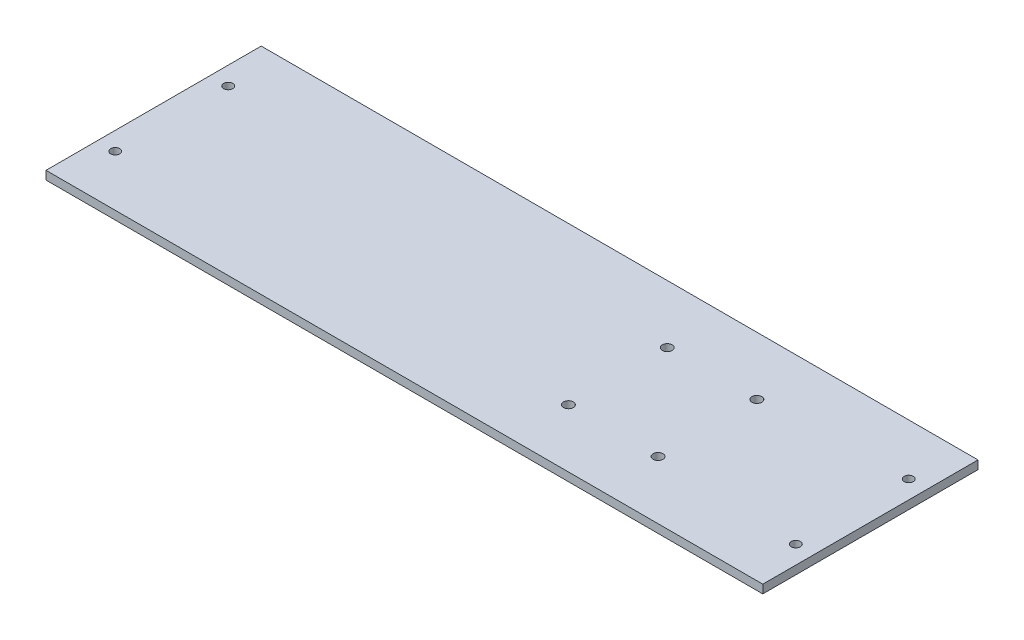
ISO-10303-21;
HEADER;
FILE_DESCRIPTION(('STEP AP214'),'2;1');
FILE_NAME('part.step','',(''),(''),'','','');
FILE_SCHEMA(('AUTOMOTIVE_DESIGN { 1 0 10303 214 1 1 1 1 }'));
ENDSEC;
DATA;
#1=APPLICATION_CONTEXT('core data for automotive mechanical design processes');
#2=APPLICATION_PROTOCOL_DEFINITION('international standard','automotive_design',2000,#1);
#3=PRODUCT_CONTEXT('',#1,'mechanical');
#4=PRODUCT('Part','Part','',(#3));
#5=PRODUCT_RELATED_PRODUCT_CATEGORY('part','',(#4));
#6=PRODUCT_DEFINITION_FORMATION('','',#4);
#7=PRODUCT_DEFINITION_CONTEXT('part definition',#1,'design');
#8=PRODUCT_DEFINITION('design','',#6,#7);
#9=PRODUCT_DEFINITION_SHAPE('','',#8);
#10=(LENGTH_UNIT() NAMED_UNIT(*) SI_UNIT(.MILLI.,.METRE.));
#11=(NAMED_UNIT(*) PLANE_ANGLE_UNIT() SI_UNIT($,.RADIAN.));
#12=(NAMED_UNIT(*) SI_UNIT($,.STERADIAN.) SOLID_ANGLE_UNIT());
#13=UNCERTAINTY_MEASURE_WITH_UNIT(LENGTH_MEASURE(1.E-05),#10,'distance_accuracy_value','');
#14=(GEOMETRIC_REPRESENTATION_CONTEXT(3) GLOBAL_UNCERTAINTY_ASSIGNED_CONTEXT((#13)) GLOBAL_UNIT_ASSIGNED_CONTEXT((#10,
#11,#12)) REPRESENTATION_CONTEXT('',''));
#15=CARTESIAN_POINT('',(0.,0.,0.));
#16=DIRECTION('',(0.,0.,1.));
#17=DIRECTION('',(1.,0.,0.));
#18=AXIS2_PLACEMENT_3D('',#15,#16,#17);
#19=CARTESIAN_POINT('',(253.8,6.,-76.2));
#20=DIRECTION('',(-1.,0.,0.));
#21=DIRECTION('',(0.,0.,1.));
#22=AXIS2_PLACEMENT_3D('',#19,#20,#21);
#23=PLANE('',#22);
#24=DIRECTION('',(0.,0.,-1.));
#25=VECTOR('',#24,1.);
#26=CARTESIAN_POINT('',(253.8,0.,-76.2));
#27=LINE('',#26,#25);
#28=CARTESIAN_POINT('',(253.8,0.,76.2));
#29=VERTEX_POINT('',#28);
#30=CARTESIAN_POINT('',(253.8,0.,-76.2));
#31=VERTEX_POINT('',#30);
#32=EDGE_CURVE('E112',#29,#31,#27,.T.);
#33=ORIENTED_EDGE('',*,*,#32,.T.);
#34=DIRECTION('',(0.,-1.,0.));
#35=VECTOR('',#34,1.);
#36=CARTESIAN_POINT('',(253.8,6.,-76.2));
#37=LINE('',#36,#35);
#38=CARTESIAN_POINT('',(253.8,6.,-76.2));
#39=VERTEX_POINT('',#38);
#40=EDGE_CURVE('E11',#39,#31,#37,.T.);
#41=ORIENTED_EDGE('',*,*,#40,.F.);
#42=DIRECTION('',(0.,0.,-1.));
#43=VECTOR('',#42,1.);
#44=CARTESIAN_POINT('',(253.8,6.,-76.2));
#45=LINE('',#44,#43);
#46=CARTESIAN_POINT('',(253.8,6.,76.2));
#47=VERTEX_POINT('',#46);
#48=EDGE_CURVE('E96',#47,#39,#45,.T.);
#49=ORIENTED_EDGE('',*,*,#48,.F.);
#50=DIRECTION('',(0.,-1.,0.));
#51=VECTOR('',#50,1.);
#52=CARTESIAN_POINT('',(253.8,6.,76.2));
#53=LINE('',#52,#51);
#54=EDGE_CURVE('E108',#47,#29,#53,.T.);
#55=ORIENTED_EDGE('',*,*,#54,.T.);
#56=EDGE_LOOP('',(#33,#41,#49,#55));
#57=FACE_BOUND('',#56,.T.);
#58=ADVANCED_FACE('F44',(#57),#23,.F.);
#59=CARTESIAN_POINT('',(-253.8,6.,-76.2));
#60=DIRECTION('',(0.,0.,1.));
#61=DIRECTION('',(1.,0.,0.));
#62=AXIS2_PLACEMENT_3D('',#59,#60,#61);
#63=PLANE('',#62);
#64=DIRECTION('',(-1.,0.,0.));
#65=VECTOR('',#64,1.);
#66=CARTESIAN_POINT('',(-253.8,0.,-76.2));
#67=LINE('',#66,#65);
#68=CARTESIAN_POINT('',(-253.8,0.,-76.2));
#69=VERTEX_POINT('',#68);
#70=EDGE_CURVE('E101',#31,#69,#67,.T.);
#71=ORIENTED_EDGE('',*,*,#70,.T.);
#72=DIRECTION('',(0.,-1.,0.));
#73=VECTOR('',#72,1.);
#74=CARTESIAN_POINT('',(-253.8,6.,-76.2));
#75=LINE('',#74,#73);
#76=CARTESIAN_POINT('',(-253.8,6.,-76.2));
#77=VERTEX_POINT('',#76);
#78=EDGE_CURVE('E53',#77,#69,#75,.T.);
#79=ORIENTED_EDGE('',*,*,#78,.F.);
#80=DIRECTION('',(-1.,0.,0.));
#81=VECTOR('',#80,1.);
#82=CARTESIAN_POINT('',(-253.8,6.,-76.2));
#83=LINE('',#82,#81);
#84=EDGE_CURVE('E91',#39,#77,#83,.T.);
#85=ORIENTED_EDGE('',*,*,#84,.F.);
#86=ORIENTED_EDGE('',*,*,#40,.T.);
#87=EDGE_LOOP('',(#71,#79,#85,#86));
#88=FACE_BOUND('',#87,.T.);
#89=ADVANCED_FACE('F100',(#88),#63,.F.);
#90=CARTESIAN_POINT('',(-253.8,6.,-76.2));
#91=DIRECTION('',(1.,0.,0.));
#92=DIRECTION('',(0.,0.,-1.));
#93=AXIS2_PLACEMENT_3D('',#90,#91,#92);
#94=PLANE('',#93);
#95=DIRECTION('',(0.,0.,1.));
#96=VECTOR('',#95,1.);
#97=CARTESIAN_POINT('',(-253.8,0.,-76.2));
#98=LINE('',#97,#96);
#99=CARTESIAN_POINT('',(-253.8,0.,76.2));
#100=VERTEX_POINT('',#99);
#101=EDGE_CURVE('E78',#69,#100,#98,.T.);
#102=ORIENTED_EDGE('',*,*,#101,.T.);
#103=DIRECTION('',(0.,-1.,0.));
#104=VECTOR('',#103,1.);
#105=CARTESIAN_POINT('',(-253.8,6.,76.2));
#106=LINE('',#105,#104);
#107=CARTESIAN_POINT('',(-253.8,6.,76.2));
#108=VERTEX_POINT('',#107);
#109=EDGE_CURVE('E103',#108,#100,#106,.T.);
#110=ORIENTED_EDGE('',*,*,#109,.F.);
#111=DIRECTION('',(0.,0.,1.));
#112=VECTOR('',#111,1.);
#113=CARTESIAN_POINT('',(-253.8,6.,-76.2));
#114=LINE('',#113,#112);
#115=EDGE_CURVE('E94',#77,#108,#114,.T.);
#116=ORIENTED_EDGE('',*,*,#115,.F.);
#117=ORIENTED_EDGE('',*,*,#78,.T.);
#118=EDGE_LOOP('',(#102,#110,#116,#117));
#119=FACE_BOUND('',#118,.T.);
#120=ADVANCED_FACE('F104',(#119),#94,.F.);
#121=CARTESIAN_POINT('',(-253.8,6.,76.2));
#122=DIRECTION('',(0.,0.,-1.));
#123=DIRECTION('',(-1.,0.,0.));
#124=AXIS2_PLACEMENT_3D('',#121,#122,#123);
#125=PLANE('',#124);
#126=DIRECTION('',(1.,0.,0.));
#127=VECTOR('',#126,1.);
#128=CARTESIAN_POINT('',(-253.8,0.,76.2));
#129=LINE('',#128,#127);
#130=EDGE_CURVE('E84',#100,#29,#129,.T.);
#131=ORIENTED_EDGE('',*,*,#130,.T.);
#132=ORIENTED_EDGE('',*,*,#54,.F.);
#133=DIRECTION('',(1.,0.,0.));
#134=VECTOR('',#133,1.);
#135=CARTESIAN_POINT('',(-253.8,6.,76.2));
#136=LINE('',#135,#134);
#137=EDGE_CURVE('E61',#108,#47,#136,.T.);
#138=ORIENTED_EDGE('',*,*,#137,.F.);
#139=ORIENTED_EDGE('',*,*,#109,.T.);
#140=EDGE_LOOP('',(#131,#132,#138,#139));
#141=FACE_BOUND('',#140,.T.);
#142=ADVANCED_FACE('F126',(#141),#125,.F.);
#143=CARTESIAN_POINT('',(0.,6.,0.));
#144=DIRECTION('',(0.,1.,0.));
#145=DIRECTION('',(0.,0.,1.));
#146=AXIS2_PLACEMENT_3D('',#143,#144,#145);
#147=PLANE('',#146);
#148=CARTESIAN_POINT('',(138.430000000001,6.,34.9999999999998));
#149=DIRECTION('',(0.,1.,0.));
#150=DIRECTION('',(0.,0.,1.));
#151=AXIS2_PLACEMENT_3D('',#148,#149,#150);
#152=CIRCLE('',#151,3.49999999999999);
#153=CARTESIAN_POINT('',(138.430000000001,6.,38.4999999999998));
#154=VERTEX_POINT('',#153);
#155=EDGE_CURVE('E177',#154,#154,#152,.T.);
#156=ORIENTED_EDGE('',*,*,#155,.F.);
#157=EDGE_LOOP('',(#156));
#158=FACE_BOUND('',#157,.T.);
#159=CARTESIAN_POINT('',(74.9300000000006,6.,35.0000000000002));
#160=DIRECTION('',(0.,1.,0.));
#161=DIRECTION('',(0.,0.,1.));
#162=AXIS2_PLACEMENT_3D('',#159,#160,#161);
#163=CIRCLE('',#162,3.49999999999999);
#164=CARTESIAN_POINT('',(74.9300000000006,6.,38.5000000000002));
#165=VERTEX_POINT('',#164);
#166=EDGE_CURVE('E185',#165,#165,#163,.T.);
#167=ORIENTED_EDGE('',*,*,#166,.F.);
#168=EDGE_LOOP('',(#167));
#169=FACE_BOUND('',#168,.T.);
#170=CARTESIAN_POINT('',(74.9299999999999,6.,-34.9999999999998));
#171=DIRECTION('',(0.,1.,0.));
#172=DIRECTION('',(0.,0.,1.));
#173=AXIS2_PLACEMENT_3D('',#170,#171,#172);
#174=CIRCLE('',#173,3.49999999999999);
#175=CARTESIAN_POINT('',(74.9299999999999,6.,-31.4999999999998));
#176=VERTEX_POINT('',#175);
#177=EDGE_CURVE('E169',#176,#176,#174,.T.);
#178=ORIENTED_EDGE('',*,*,#177,.F.);
#179=EDGE_LOOP('',(#178));
#180=FACE_BOUND('',#179,.T.);
#181=CARTESIAN_POINT('',(138.43,6.,-35.0000000000002));
#182=DIRECTION('',(0.,1.,0.));
#183=DIRECTION('',(0.,0.,1.));
#184=AXIS2_PLACEMENT_3D('',#181,#182,#183);
#185=CIRCLE('',#184,3.49999999999999);
#186=CARTESIAN_POINT('',(138.43,6.,-31.5000000000002));
#187=VERTEX_POINT('',#186);
#188=EDGE_CURVE('E165',#187,#187,#185,.T.);
#189=ORIENTED_EDGE('',*,*,#188,.F.);
#190=EDGE_LOOP('',(#189));
#191=FACE_BOUND('',#190,.T.);
#192=CARTESIAN_POINT('',(240.96,6.,40.));
#193=DIRECTION('',(0.,1.,0.));
#194=DIRECTION('',(0.,0.,1.));
#195=AXIS2_PLACEMENT_3D('',#192,#193,#194);
#196=CIRCLE('',#195,3.25000000000001);
#197=CARTESIAN_POINT('',(240.96,6.,43.25));
#198=VERTEX_POINT('',#197);
#199=EDGE_CURVE('E137',#198,#198,#196,.T.);
#200=ORIENTED_EDGE('',*,*,#199,.F.);
#201=EDGE_LOOP('',(#200));
#202=FACE_BOUND('',#201,.T.);
#203=CARTESIAN_POINT('',(-240.96,6.,-39.9999999999966));
#204=DIRECTION('',(0.,1.,0.));
#205=DIRECTION('',(0.,0.,1.));
#206=AXIS2_PLACEMENT_3D('',#203,#204,#205);
#207=CIRCLE('',#206,3.25000000000001);
#208=CARTESIAN_POINT('',(-240.96,6.,-36.7499999999966));
#209=VERTEX_POINT('',#208);
#210=EDGE_CURVE('E145',#209,#209,#207,.T.);
#211=ORIENTED_EDGE('',*,*,#210,.F.);
#212=EDGE_LOOP('',(#211));
#213=FACE_BOUND('',#212,.T.);
#214=CARTESIAN_POINT('',(-240.96,6.,40.0000000000034));
#215=DIRECTION('',(0.,1.,0.));
#216=DIRECTION('',(0.,0.,1.));
#217=AXIS2_PLACEMENT_3D('',#214,#215,#216);
#218=CIRCLE('',#217,3.25000000000001);
#219=CARTESIAN_POINT('',(-240.96,6.,43.2500000000034));
#220=VERTEX_POINT('',#219);
#221=EDGE_CURVE('E146',#220,#220,#218,.T.);
#222=ORIENTED_EDGE('',*,*,#221,.F.);
#223=EDGE_LOOP('',(#222));
#224=FACE_BOUND('',#223,.T.);
#225=CARTESIAN_POINT('',(240.96,6.,-40.));
#226=DIRECTION('',(0.,1.,0.));
#227=DIRECTION('',(0.,0.,1.));
#228=AXIS2_PLACEMENT_3D('',#225,#226,#227);
#229=CIRCLE('',#228,3.25000000000001);
#230=CARTESIAN_POINT('',(240.96,6.,-36.75));
#231=VERTEX_POINT('',#230);
#232=EDGE_CURVE('E133',#231,#231,#229,.T.);
#233=ORIENTED_EDGE('',*,*,#232,.F.);
#234=EDGE_LOOP('',(#233));
#235=FACE_BOUND('',#234,.T.);
#236=ORIENTED_EDGE('',*,*,#48,.T.);
#237=ORIENTED_EDGE('',*,*,#84,.T.);
#238=ORIENTED_EDGE('',*,*,#115,.T.);
#239=ORIENTED_EDGE('',*,*,#137,.T.);
#240=EDGE_LOOP('',(#236,#237,#238,#239));
#241=FACE_BOUND('',#240,.T.);
#242=ADVANCED_FACE('F92',(#158,#169,#180,#191,#202,#213,#224,#235,#241),#147,.T.);
#243=CARTESIAN_POINT('',(0.,0.,0.));
#244=DIRECTION('',(0.,1.,0.));
#245=DIRECTION('',(0.,0.,1.));
#246=AXIS2_PLACEMENT_3D('',#243,#244,#245);
#247=PLANE('',#246);
#248=CARTESIAN_POINT('',(138.430000000001,0.,34.9999999999998));
#249=DIRECTION('',(0.,1.,0.));
#250=DIRECTION('',(0.,0.,1.));
#251=AXIS2_PLACEMENT_3D('',#248,#249,#250);
#252=CIRCLE('',#251,3.49999999999999);
#253=CARTESIAN_POINT('',(138.430000000001,0.,38.4999999999998));
#254=VERTEX_POINT('',#253);
#255=EDGE_CURVE('E173',#254,#254,#252,.T.);
#256=ORIENTED_EDGE('',*,*,#255,.T.);
#257=EDGE_LOOP('',(#256));
#258=FACE_BOUND('',#257,.T.);
#259=CARTESIAN_POINT('',(74.9300000000006,0.,35.0000000000002));
#260=DIRECTION('',(0.,1.,0.));
#261=DIRECTION('',(0.,0.,1.));
#262=AXIS2_PLACEMENT_3D('',#259,#260,#261);
#263=CIRCLE('',#262,3.49999999999999);
#264=CARTESIAN_POINT('',(74.9300000000006,0.,38.5000000000002));
#265=VERTEX_POINT('',#264);
#266=EDGE_CURVE('E181',#265,#265,#263,.T.);
#267=ORIENTED_EDGE('',*,*,#266,.T.);
#268=EDGE_LOOP('',(#267));
#269=FACE_BOUND('',#268,.T.);
#270=CARTESIAN_POINT('',(74.9299999999999,0.,-34.9999999999998));
#271=DIRECTION('',(0.,1.,0.));
#272=DIRECTION('',(0.,0.,1.));
#273=AXIS2_PLACEMENT_3D('',#270,#271,#272);
#274=CIRCLE('',#273,3.49999999999999);
#275=CARTESIAN_POINT('',(74.9299999999999,0.,-31.4999999999998));
#276=VERTEX_POINT('',#275);
#277=EDGE_CURVE('E189',#276,#276,#274,.T.);
#278=ORIENTED_EDGE('',*,*,#277,.T.);
#279=EDGE_LOOP('',(#278));
#280=FACE_BOUND('',#279,.T.);
#281=CARTESIAN_POINT('',(138.43,0.,-35.0000000000002));
#282=DIRECTION('',(0.,1.,0.));
#283=DIRECTION('',(0.,0.,1.));
#284=AXIS2_PLACEMENT_3D('',#281,#282,#283);
#285=CIRCLE('',#284,3.49999999999999);
#286=CARTESIAN_POINT('',(138.43,0.,-31.5000000000002));
#287=VERTEX_POINT('',#286);
#288=EDGE_CURVE('E161',#287,#287,#285,.T.);
#289=ORIENTED_EDGE('',*,*,#288,.T.);
#290=EDGE_LOOP('',(#289));
#291=FACE_BOUND('',#290,.T.);
#292=CARTESIAN_POINT('',(240.96,0.,40.));
#293=DIRECTION('',(0.,1.,0.));
#294=DIRECTION('',(0.,0.,1.));
#295=AXIS2_PLACEMENT_3D('',#292,#293,#294);
#296=CIRCLE('',#295,3.25000000000001);
#297=CARTESIAN_POINT('',(240.96,0.,43.25));
#298=VERTEX_POINT('',#297);
#299=EDGE_CURVE('E150',#298,#298,#296,.T.);
#300=ORIENTED_EDGE('',*,*,#299,.T.);
#301=EDGE_LOOP('',(#300));
#302=FACE_BOUND('',#301,.T.);
#303=CARTESIAN_POINT('',(-240.96,0.,-39.9999999999966));
#304=DIRECTION('',(0.,1.,0.));
#305=DIRECTION('',(0.,0.,1.));
#306=AXIS2_PLACEMENT_3D('',#303,#304,#305);
#307=CIRCLE('',#306,3.25000000000001);
#308=CARTESIAN_POINT('',(-240.96,0.,-36.7499999999966));
#309=VERTEX_POINT('',#308);
#310=EDGE_CURVE('E141',#309,#309,#307,.T.);
#311=ORIENTED_EDGE('',*,*,#310,.T.);
#312=EDGE_LOOP('',(#311));
#313=FACE_BOUND('',#312,.T.);
#314=CARTESIAN_POINT('',(-240.96,0.,40.0000000000034));
#315=DIRECTION('',(0.,1.,0.));
#316=DIRECTION('',(0.,0.,1.));
#317=AXIS2_PLACEMENT_3D('',#314,#315,#316);
#318=CIRCLE('',#317,3.25000000000001);
#319=CARTESIAN_POINT('',(-240.96,0.,43.2500000000034));
#320=VERTEX_POINT('',#319);
#321=EDGE_CURVE('E157',#320,#320,#318,.T.);
#322=ORIENTED_EDGE('',*,*,#321,.T.);
#323=EDGE_LOOP('',(#322));
#324=FACE_BOUND('',#323,.T.);
#325=CARTESIAN_POINT('',(240.96,0.,-40.));
#326=DIRECTION('',(0.,1.,0.));
#327=DIRECTION('',(0.,0.,1.));
#328=AXIS2_PLACEMENT_3D('',#325,#326,#327);
#329=CIRCLE('',#328,3.25000000000001);
#330=CARTESIAN_POINT('',(240.96,0.,-36.75));
#331=VERTEX_POINT('',#330);
#332=EDGE_CURVE('E116',#331,#331,#329,.T.);
#333=ORIENTED_EDGE('',*,*,#332,.T.);
#334=EDGE_LOOP('',(#333));
#335=FACE_BOUND('',#334,.T.);
#336=ORIENTED_EDGE('',*,*,#32,.F.);
#337=ORIENTED_EDGE('',*,*,#130,.F.);
#338=ORIENTED_EDGE('',*,*,#101,.F.);
#339=ORIENTED_EDGE('',*,*,#70,.F.);
#340=EDGE_LOOP('',(#336,#337,#338,#339));
#341=FACE_BOUND('',#340,.T.);
#342=ADVANCED_FACE('F129',(#258,#269,#280,#291,#302,#313,#324,#335,#341),#247,.F.);
#343=CARTESIAN_POINT('',(240.96,0.,-40.));
#344=DIRECTION('',(0.,1.,0.));
#345=DIRECTION('',(0.,0.,1.));
#346=AXIS2_PLACEMENT_3D('',#343,#344,#345);
#347=CYLINDRICAL_SURFACE('',#346,3.25000000000001);
#348=ORIENTED_EDGE('',*,*,#332,.F.);
#349=EDGE_LOOP('',(#348));
#350=FACE_BOUND('',#349,.T.);
#351=ORIENTED_EDGE('',*,*,#232,.T.);
#352=EDGE_LOOP('',(#351));
#353=FACE_BOUND('',#352,.T.);
#354=ADVANCED_FACE('F213',(#350,#353),#347,.F.);
#355=CARTESIAN_POINT('',(-240.96,0.,40.0000000000034));
#356=DIRECTION('',(0.,1.,0.));
#357=DIRECTION('',(0.,0.,1.));
#358=AXIS2_PLACEMENT_3D('',#355,#356,#357);
#359=CYLINDRICAL_SURFACE('',#358,3.25000000000001);
#360=ORIENTED_EDGE('',*,*,#321,.F.);
#361=EDGE_LOOP('',(#360));
#362=FACE_BOUND('',#361,.T.);
#363=ORIENTED_EDGE('',*,*,#221,.T.);
#364=EDGE_LOOP('',(#363));
#365=FACE_BOUND('',#364,.T.);
#366=ADVANCED_FACE('F215',(#362,#365),#359,.F.);
#367=CARTESIAN_POINT('',(-240.96,0.,-39.9999999999966));
#368=DIRECTION('',(0.,1.,0.));
#369=DIRECTION('',(0.,0.,1.));
#370=AXIS2_PLACEMENT_3D('',#367,#368,#369);
#371=CYLINDRICAL_SURFACE('',#370,3.25000000000001);
#372=ORIENTED_EDGE('',*,*,#310,.F.);
#373=EDGE_LOOP('',(#372));
#374=FACE_BOUND('',#373,.T.);
#375=ORIENTED_EDGE('',*,*,#210,.T.);
#376=EDGE_LOOP('',(#375));
#377=FACE_BOUND('',#376,.T.);
#378=ADVANCED_FACE('F222',(#374,#377),#371,.F.);
#379=CARTESIAN_POINT('',(240.96,0.,40.));
#380=DIRECTION('',(0.,1.,0.));
#381=DIRECTION('',(0.,0.,1.));
#382=AXIS2_PLACEMENT_3D('',#379,#380,#381);
#383=CYLINDRICAL_SURFACE('',#382,3.25000000000001);
#384=ORIENTED_EDGE('',*,*,#299,.F.);
#385=EDGE_LOOP('',(#384));
#386=FACE_BOUND('',#385,.T.);
#387=ORIENTED_EDGE('',*,*,#199,.T.);
#388=EDGE_LOOP('',(#387));
#389=FACE_BOUND('',#388,.T.);
#390=ADVANCED_FACE('F283',(#386,#389),#383,.F.);
#391=CARTESIAN_POINT('',(138.43,0.,-35.0000000000002));
#392=DIRECTION('',(0.,1.,0.));
#393=DIRECTION('',(0.,0.,1.));
#394=AXIS2_PLACEMENT_3D('',#391,#392,#393);
#395=CYLINDRICAL_SURFACE('',#394,3.49999999999999);
#396=ORIENTED_EDGE('',*,*,#288,.F.);
#397=EDGE_LOOP('',(#396));
#398=FACE_BOUND('',#397,.T.);
#399=ORIENTED_EDGE('',*,*,#188,.T.);
#400=EDGE_LOOP('',(#399));
#401=FACE_BOUND('',#400,.T.);
#402=ADVANCED_FACE('F291',(#398,#401),#395,.F.);
#403=CARTESIAN_POINT('',(74.9299999999999,0.,-34.9999999999998));
#404=DIRECTION('',(0.,1.,0.));
#405=DIRECTION('',(0.,0.,1.));
#406=AXIS2_PLACEMENT_3D('',#403,#404,#405);
#407=CYLINDRICAL_SURFACE('',#406,3.49999999999999);
#408=ORIENTED_EDGE('',*,*,#277,.F.);
#409=EDGE_LOOP('',(#408));
#410=FACE_BOUND('',#409,.T.);
#411=ORIENTED_EDGE('',*,*,#177,.T.);
#412=EDGE_LOOP('',(#411));
#413=FACE_BOUND('',#412,.T.);
#414=ADVANCED_FACE('F197',(#410,#413),#407,.F.);
#415=CARTESIAN_POINT('',(74.9300000000006,0.,35.0000000000002));
#416=DIRECTION('',(0.,1.,0.));
#417=DIRECTION('',(0.,0.,1.));
#418=AXIS2_PLACEMENT_3D('',#415,#416,#417);
#419=CYLINDRICAL_SURFACE('',#418,3.49999999999999);
#420=ORIENTED_EDGE('',*,*,#266,.F.);
#421=EDGE_LOOP('',(#420));
#422=FACE_BOUND('',#421,.T.);
#423=ORIENTED_EDGE('',*,*,#166,.T.);
#424=EDGE_LOOP('',(#423));
#425=FACE_BOUND('',#424,.T.);
#426=ADVANCED_FACE('F308',(#422,#425),#419,.F.);
#427=CARTESIAN_POINT('',(138.430000000001,0.,34.9999999999998));
#428=DIRECTION('',(0.,1.,0.));
#429=DIRECTION('',(0.,0.,1.));
#430=AXIS2_PLACEMENT_3D('',#427,#428,#429);
#431=CYLINDRICAL_SURFACE('',#430,3.49999999999999);
#432=ORIENTED_EDGE('',*,*,#255,.F.);
#433=EDGE_LOOP('',(#432));
#434=FACE_BOUND('',#433,.T.);
#435=ORIENTED_EDGE('',*,*,#155,.T.);
#436=EDGE_LOOP('',(#435));
#437=FACE_BOUND('',#436,.T.);
#438=ADVANCED_FACE('F317',(#434,#437),#431,.F.);
#439=CLOSED_SHELL('',(#58,#89,#120,#142,#242,#342,#354,#366,#378,#390,#402,#414,#426,#438));
#440=MANIFOLD_SOLID_BREP('B2',#439);
#441=ADVANCED_BREP_SHAPE_REPRESENTATION('',(#18,#440),#14);
#442=SHAPE_DEFINITION_REPRESENTATION(#9,#441);
ENDSEC;
END-ISO-10303-21;
